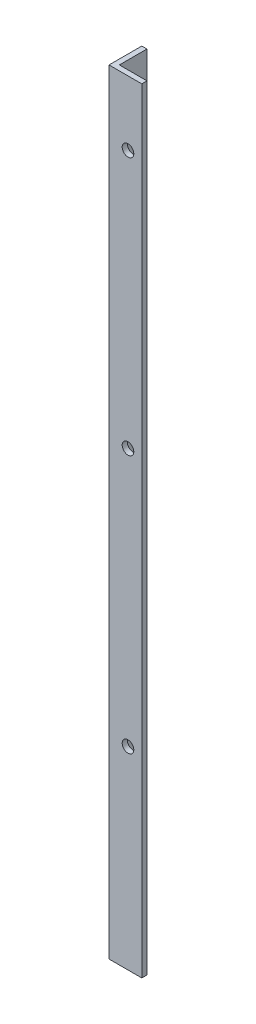
ISO-10303-21;
HEADER;
FILE_DESCRIPTION(('STEP AP214'),'2;1');
FILE_NAME('part.step','',(''),(''),'','','');
FILE_SCHEMA(('AUTOMOTIVE_DESIGN { 1 0 10303 214 1 1 1 1 }'));
ENDSEC;
DATA;
#1=APPLICATION_CONTEXT('core data for automotive mechanical design processes');
#2=APPLICATION_PROTOCOL_DEFINITION('international standard','automotive_design',2000,#1);
#3=PRODUCT_CONTEXT('',#1,'mechanical');
#4=PRODUCT('Part','Part','',(#3));
#5=PRODUCT_RELATED_PRODUCT_CATEGORY('part','',(#4));
#6=PRODUCT_DEFINITION_FORMATION('','',#4);
#7=PRODUCT_DEFINITION_CONTEXT('part definition',#1,'design');
#8=PRODUCT_DEFINITION('design','',#6,#7);
#9=PRODUCT_DEFINITION_SHAPE('','',#8);
#10=(LENGTH_UNIT() NAMED_UNIT(*) SI_UNIT(.MILLI.,.METRE.));
#11=(NAMED_UNIT(*) PLANE_ANGLE_UNIT() SI_UNIT($,.RADIAN.));
#12=(NAMED_UNIT(*) SI_UNIT($,.STERADIAN.) SOLID_ANGLE_UNIT());
#13=UNCERTAINTY_MEASURE_WITH_UNIT(LENGTH_MEASURE(1.E-05),#10,'distance_accuracy_value','');
#14=(GEOMETRIC_REPRESENTATION_CONTEXT(3) GLOBAL_UNCERTAINTY_ASSIGNED_CONTEXT((#13)) GLOBAL_UNIT_ASSIGNED_CONTEXT((#10,
#11,#12)) REPRESENTATION_CONTEXT('',''));
#15=CARTESIAN_POINT('',(0.,0.,0.));
#16=DIRECTION('',(0.,0.,1.));
#17=DIRECTION('',(1.,0.,0.));
#18=AXIS2_PLACEMENT_3D('',#15,#16,#17);
#19=CARTESIAN_POINT('',(0.,300.,0.));
#20=DIRECTION('',(1.,0.,0.));
#21=DIRECTION('',(0.,0.,-1.));
#22=AXIS2_PLACEMENT_3D('',#19,#20,#21);
#23=PLANE('',#22);
#24=CARTESIAN_POINT('',(0.,253.6,-7.94000000000002));
#25=DIRECTION('',(-1.,0.,0.));
#26=DIRECTION('',(0.,0.,1.));
#27=AXIS2_PLACEMENT_3D('',#24,#25,#26);
#28=CIRCLE('',#27,2.25000000000001);
#29=CARTESIAN_POINT('',(0.,253.6,-5.69000000000001));
#30=VERTEX_POINT('',#29);
#31=EDGE_CURVE('E167',#30,#30,#28,.T.);
#32=ORIENTED_EDGE('',*,*,#31,.F.);
#33=EDGE_LOOP('',(#32));
#34=FACE_BOUND('',#33,.T.);
#35=CARTESIAN_POINT('',(0.,225.,-7.35000000000001));
#36=DIRECTION('',(1.,0.,0.));
#37=DIRECTION('',(0.,0.,-1.));
#38=AXIS2_PLACEMENT_3D('',#35,#36,#37);
#39=CIRCLE('',#38,2.25);
#40=CARTESIAN_POINT('',(0.,225.,-9.60000000000001));
#41=VERTEX_POINT('',#40);
#42=EDGE_CURVE('E171',#41,#41,#39,.T.);
#43=ORIENTED_EDGE('',*,*,#42,.T.);
#44=EDGE_LOOP('',(#43));
#45=FACE_BOUND('',#44,.T.);
#46=CARTESIAN_POINT('',(0.,125.,-7.35000000000001));
#47=DIRECTION('',(1.,0.,0.));
#48=DIRECTION('',(0.,0.,-1.));
#49=AXIS2_PLACEMENT_3D('',#46,#47,#48);
#50=CIRCLE('',#49,2.25);
#51=CARTESIAN_POINT('',(0.,125.,-9.60000000000001));
#52=VERTEX_POINT('',#51);
#53=EDGE_CURVE('E175',#52,#52,#50,.T.);
#54=ORIENTED_EDGE('',*,*,#53,.T.);
#55=EDGE_LOOP('',(#54));
#56=FACE_BOUND('',#55,.T.);
#57=CARTESIAN_POINT('',(0.,25.,-7.35000000000001));
#58=DIRECTION('',(1.,0.,0.));
#59=DIRECTION('',(0.,0.,-1.));
#60=AXIS2_PLACEMENT_3D('',#57,#58,#59);
#61=CIRCLE('',#60,2.25);
#62=CARTESIAN_POINT('',(0.,25.,-9.60000000000001));
#63=VERTEX_POINT('',#62);
#64=EDGE_CURVE('E178',#63,#63,#61,.T.);
#65=ORIENTED_EDGE('',*,*,#64,.T.);
#66=EDGE_LOOP('',(#65));
#67=FACE_BOUND('',#66,.T.);
#68=DIRECTION('',(0.,0.,1.));
#69=VECTOR('',#68,1.);
#70=CARTESIAN_POINT('',(0.,0.,0.));
#71=LINE('',#70,#69);
#72=CARTESIAN_POINT('',(0.,0.,-12.7));
#73=VERTEX_POINT('',#72);
#74=CARTESIAN_POINT('',(0.,0.,0.));
#75=VERTEX_POINT('',#74);
#76=EDGE_CURVE('E121',#73,#75,#71,.T.);
#77=ORIENTED_EDGE('',*,*,#76,.T.);
#78=DIRECTION('',(0.,-1.,0.));
#79=VECTOR('',#78,1.);
#80=CARTESIAN_POINT('',(0.,300.,0.));
#81=LINE('',#80,#79);
#82=CARTESIAN_POINT('',(0.,300.,0.));
#83=VERTEX_POINT('',#82);
#84=EDGE_CURVE('E11',#83,#75,#81,.T.);
#85=ORIENTED_EDGE('',*,*,#84,.F.);
#86=DIRECTION('',(0.,0.,1.));
#87=VECTOR('',#86,1.);
#88=CARTESIAN_POINT('',(0.,300.,0.));
#89=LINE('',#88,#87);
#90=CARTESIAN_POINT('',(0.,300.,-12.7));
#91=VERTEX_POINT('',#90);
#92=EDGE_CURVE('E132',#91,#83,#89,.T.);
#93=ORIENTED_EDGE('',*,*,#92,.F.);
#94=DIRECTION('',(0.,-1.,0.));
#95=VECTOR('',#94,1.);
#96=CARTESIAN_POINT('',(0.,300.,-12.7));
#97=LINE('',#96,#95);
#98=EDGE_CURVE('E117',#91,#73,#97,.T.);
#99=ORIENTED_EDGE('',*,*,#98,.T.);
#100=EDGE_LOOP('',(#77,#85,#93,#99));
#101=FACE_BOUND('',#100,.T.);
#102=ADVANCED_FACE('F36',(#34,#45,#56,#67,#101),#23,.F.);
#103=CARTESIAN_POINT('',(0.,300.,0.));
#104=DIRECTION('',(0.,0.,-1.));
#105=DIRECTION('',(-1.,0.,0.));
#106=AXIS2_PLACEMENT_3D('',#103,#104,#105);
#107=PLANE('',#106);
#108=CARTESIAN_POINT('',(7.35,275.,0.));
#109=DIRECTION('',(0.,0.,-1.));
#110=DIRECTION('',(-1.,0.,0.));
#111=AXIS2_PLACEMENT_3D('',#108,#109,#110);
#112=CIRCLE('',#111,2.25);
#113=CARTESIAN_POINT('',(5.09999999999999,275.,0.));
#114=VERTEX_POINT('',#113);
#115=EDGE_CURVE('E125',#114,#114,#112,.T.);
#116=ORIENTED_EDGE('',*,*,#115,.T.);
#117=EDGE_LOOP('',(#116));
#118=FACE_BOUND('',#117,.T.);
#119=CARTESIAN_POINT('',(7.35,175.,0.));
#120=DIRECTION('',(0.,0.,-1.));
#121=DIRECTION('',(-1.,0.,0.));
#122=AXIS2_PLACEMENT_3D('',#119,#120,#121);
#123=CIRCLE('',#122,2.25);
#124=CARTESIAN_POINT('',(5.09999999999999,175.,0.));
#125=VERTEX_POINT('',#124);
#126=EDGE_CURVE('E203',#125,#125,#123,.T.);
#127=ORIENTED_EDGE('',*,*,#126,.T.);
#128=EDGE_LOOP('',(#127));
#129=FACE_BOUND('',#128,.T.);
#130=CARTESIAN_POINT('',(7.35,75.,0.));
#131=DIRECTION('',(0.,0.,-1.));
#132=DIRECTION('',(-1.,0.,0.));
#133=AXIS2_PLACEMENT_3D('',#130,#131,#132);
#134=CIRCLE('',#133,2.25);
#135=CARTESIAN_POINT('',(5.09999999999999,75.,0.));
#136=VERTEX_POINT('',#135);
#137=EDGE_CURVE('E195',#136,#136,#134,.T.);
#138=ORIENTED_EDGE('',*,*,#137,.T.);
#139=EDGE_LOOP('',(#138));
#140=FACE_BOUND('',#139,.T.);
#141=DIRECTION('',(1.,0.,0.));
#142=VECTOR('',#141,1.);
#143=CARTESIAN_POINT('',(0.,0.,0.));
#144=LINE('',#143,#142);
#145=CARTESIAN_POINT('',(12.7,0.,0.));
#146=VERTEX_POINT('',#145);
#147=EDGE_CURVE('E124',#75,#146,#144,.T.);
#148=ORIENTED_EDGE('',*,*,#147,.T.);
#149=DIRECTION('',(0.,-1.,0.));
#150=VECTOR('',#149,1.);
#151=CARTESIAN_POINT('',(12.7,300.,0.));
#152=LINE('',#151,#150);
#153=CARTESIAN_POINT('',(12.7,300.,0.));
#154=VERTEX_POINT('',#153);
#155=EDGE_CURVE('E45',#154,#146,#152,.T.);
#156=ORIENTED_EDGE('',*,*,#155,.F.);
#157=DIRECTION('',(1.,0.,0.));
#158=VECTOR('',#157,1.);
#159=CARTESIAN_POINT('',(0.,300.,0.));
#160=LINE('',#159,#158);
#161=EDGE_CURVE('E90',#83,#154,#160,.T.);
#162=ORIENTED_EDGE('',*,*,#161,.F.);
#163=ORIENTED_EDGE('',*,*,#84,.T.);
#164=EDGE_LOOP('',(#148,#156,#162,#163));
#165=FACE_BOUND('',#164,.T.);
#166=ADVANCED_FACE('F158',(#118,#129,#140,#165),#107,.F.);
#167=CARTESIAN_POINT('',(12.7,300.,0.));
#168=DIRECTION('',(-1.,0.,0.));
#169=DIRECTION('',(0.,0.,1.));
#170=AXIS2_PLACEMENT_3D('',#167,#168,#169);
#171=PLANE('',#170);
#172=DIRECTION('',(0.,0.,-1.));
#173=VECTOR('',#172,1.);
#174=CARTESIAN_POINT('',(12.7,0.,0.));
#175=LINE('',#174,#173);
#176=CARTESIAN_POINT('',(12.7,0.,-2.));
#177=VERTEX_POINT('',#176);
#178=EDGE_CURVE('E127',#146,#177,#175,.T.);
#179=ORIENTED_EDGE('',*,*,#178,.T.);
#180=DIRECTION('',(0.,-1.,0.));
#181=VECTOR('',#180,1.);
#182=CARTESIAN_POINT('',(12.7,300.,-2.));
#183=LINE('',#182,#181);
#184=CARTESIAN_POINT('',(12.7,300.,-2.));
#185=VERTEX_POINT('',#184);
#186=EDGE_CURVE('E112',#185,#177,#183,.T.);
#187=ORIENTED_EDGE('',*,*,#186,.F.);
#188=DIRECTION('',(0.,0.,-1.));
#189=VECTOR('',#188,1.);
#190=CARTESIAN_POINT('',(12.7,300.,0.));
#191=LINE('',#190,#189);
#192=EDGE_CURVE('E103',#154,#185,#191,.T.);
#193=ORIENTED_EDGE('',*,*,#192,.F.);
#194=ORIENTED_EDGE('',*,*,#155,.T.);
#195=EDGE_LOOP('',(#179,#187,#193,#194));
#196=FACE_BOUND('',#195,.T.);
#197=ADVANCED_FACE('F139',(#196),#171,.F.);
#198=CARTESIAN_POINT('',(2.,300.,-2.));
#199=DIRECTION('',(0.,0.,1.));
#200=DIRECTION('',(1.,0.,0.));
#201=AXIS2_PLACEMENT_3D('',#198,#199,#200);
#202=PLANE('',#201);
#203=CARTESIAN_POINT('',(7.35,275.,-2.));
#204=DIRECTION('',(0.,0.,-1.));
#205=DIRECTION('',(-1.,0.,0.));
#206=AXIS2_PLACEMENT_3D('',#203,#204,#205);
#207=CIRCLE('',#206,2.25);
#208=CARTESIAN_POINT('',(5.09999999999999,275.,-2.));
#209=VERTEX_POINT('',#208);
#210=EDGE_CURVE('E192',#209,#209,#207,.T.);
#211=ORIENTED_EDGE('',*,*,#210,.F.);
#212=EDGE_LOOP('',(#211));
#213=FACE_BOUND('',#212,.T.);
#214=CARTESIAN_POINT('',(7.35,175.,-2.));
#215=DIRECTION('',(0.,0.,-1.));
#216=DIRECTION('',(-1.,0.,0.));
#217=AXIS2_PLACEMENT_3D('',#214,#215,#216);
#218=CIRCLE('',#217,2.25);
#219=CARTESIAN_POINT('',(5.09999999999999,175.,-2.));
#220=VERTEX_POINT('',#219);
#221=EDGE_CURVE('E196',#220,#220,#218,.T.);
#222=ORIENTED_EDGE('',*,*,#221,.F.);
#223=EDGE_LOOP('',(#222));
#224=FACE_BOUND('',#223,.T.);
#225=CARTESIAN_POINT('',(7.35,75.,-2.));
#226=DIRECTION('',(0.,0.,-1.));
#227=DIRECTION('',(-1.,0.,0.));
#228=AXIS2_PLACEMENT_3D('',#225,#226,#227);
#229=CIRCLE('',#228,2.25);
#230=CARTESIAN_POINT('',(5.09999999999999,75.,-2.));
#231=VERTEX_POINT('',#230);
#232=EDGE_CURVE('E191',#231,#231,#229,.T.);
#233=ORIENTED_EDGE('',*,*,#232,.F.);
#234=EDGE_LOOP('',(#233));
#235=FACE_BOUND('',#234,.T.);
#236=DIRECTION('',(-1.,0.,0.));
#237=VECTOR('',#236,1.);
#238=CARTESIAN_POINT('',(2.,0.,-2.));
#239=LINE('',#238,#237);
#240=CARTESIAN_POINT('',(2.,0.,-2.));
#241=VERTEX_POINT('',#240);
#242=EDGE_CURVE('E111',#177,#241,#239,.T.);
#243=ORIENTED_EDGE('',*,*,#242,.T.);
#244=DIRECTION('',(0.,-1.,0.));
#245=VECTOR('',#244,1.);
#246=CARTESIAN_POINT('',(2.,300.,-2.));
#247=LINE('',#246,#245);
#248=CARTESIAN_POINT('',(2.,300.,-2.));
#249=VERTEX_POINT('',#248);
#250=EDGE_CURVE('E108',#249,#241,#247,.T.);
#251=ORIENTED_EDGE('',*,*,#250,.F.);
#252=DIRECTION('',(-1.,0.,0.));
#253=VECTOR('',#252,1.);
#254=CARTESIAN_POINT('',(2.,300.,-2.));
#255=LINE('',#254,#253);
#256=EDGE_CURVE('E97',#185,#249,#255,.T.);
#257=ORIENTED_EDGE('',*,*,#256,.F.);
#258=ORIENTED_EDGE('',*,*,#186,.T.);
#259=EDGE_LOOP('',(#243,#251,#257,#258));
#260=FACE_BOUND('',#259,.T.);
#261=ADVANCED_FACE('F109',(#213,#224,#235,#260),#202,.F.);
#262=CARTESIAN_POINT('',(2.,300.,-2.));
#263=DIRECTION('',(-1.,0.,0.));
#264=DIRECTION('',(0.,0.,1.));
#265=AXIS2_PLACEMENT_3D('',#262,#263,#264);
#266=PLANE('',#265);
#267=CARTESIAN_POINT('',(2.,253.6,-7.94000000000002));
#268=DIRECTION('',(-1.,0.,0.));
#269=DIRECTION('',(0.,0.,1.));
#270=AXIS2_PLACEMENT_3D('',#267,#268,#269);
#271=CIRCLE('',#270,2.25000000000001);
#272=CARTESIAN_POINT('',(2.,253.6,-5.69000000000001));
#273=VERTEX_POINT('',#272);
#274=EDGE_CURVE('E39',#273,#273,#271,.T.);
#275=ORIENTED_EDGE('',*,*,#274,.T.);
#276=EDGE_LOOP('',(#275));
#277=FACE_BOUND('',#276,.T.);
#278=CARTESIAN_POINT('',(2.,225.,-7.35000000000001));
#279=DIRECTION('',(1.,0.,0.));
#280=DIRECTION('',(0.,0.,-1.));
#281=AXIS2_PLACEMENT_3D('',#278,#279,#280);
#282=CIRCLE('',#281,2.25);
#283=CARTESIAN_POINT('',(2.,225.,-9.60000000000001));
#284=VERTEX_POINT('',#283);
#285=EDGE_CURVE('E180',#284,#284,#282,.T.);
#286=ORIENTED_EDGE('',*,*,#285,.F.);
#287=EDGE_LOOP('',(#286));
#288=FACE_BOUND('',#287,.T.);
#289=CARTESIAN_POINT('',(2.,125.,-7.35000000000001));
#290=DIRECTION('',(1.,0.,0.));
#291=DIRECTION('',(0.,0.,-1.));
#292=AXIS2_PLACEMENT_3D('',#289,#290,#291);
#293=CIRCLE('',#292,2.25);
#294=CARTESIAN_POINT('',(2.,125.,-9.60000000000001));
#295=VERTEX_POINT('',#294);
#296=EDGE_CURVE('E184',#295,#295,#293,.T.);
#297=ORIENTED_EDGE('',*,*,#296,.F.);
#298=EDGE_LOOP('',(#297));
#299=FACE_BOUND('',#298,.T.);
#300=CARTESIAN_POINT('',(2.,25.,-7.35000000000001));
#301=DIRECTION('',(1.,0.,0.));
#302=DIRECTION('',(0.,0.,-1.));
#303=AXIS2_PLACEMENT_3D('',#300,#301,#302);
#304=CIRCLE('',#303,2.25);
#305=CARTESIAN_POINT('',(2.,25.,-9.60000000000001));
#306=VERTEX_POINT('',#305);
#307=EDGE_CURVE('E187',#306,#306,#304,.T.);
#308=ORIENTED_EDGE('',*,*,#307,.F.);
#309=EDGE_LOOP('',(#308));
#310=FACE_BOUND('',#309,.T.);
#311=DIRECTION('',(0.,0.,-1.));
#312=VECTOR('',#311,1.);
#313=CARTESIAN_POINT('',(2.,0.,-2.));
#314=LINE('',#313,#312);
#315=CARTESIAN_POINT('',(2.,0.,-12.7));
#316=VERTEX_POINT('',#315);
#317=EDGE_CURVE('E76',#241,#316,#314,.T.);
#318=ORIENTED_EDGE('',*,*,#317,.T.);
#319=DIRECTION('',(0.,-1.,0.));
#320=VECTOR('',#319,1.);
#321=CARTESIAN_POINT('',(2.,300.,-12.7));
#322=LINE('',#321,#320);
#323=CARTESIAN_POINT('',(2.,300.,-12.7));
#324=VERTEX_POINT('',#323);
#325=EDGE_CURVE('E113',#324,#316,#322,.T.);
#326=ORIENTED_EDGE('',*,*,#325,.F.);
#327=DIRECTION('',(0.,0.,-1.));
#328=VECTOR('',#327,1.);
#329=CARTESIAN_POINT('',(2.,300.,-2.));
#330=LINE('',#329,#328);
#331=EDGE_CURVE('E101',#249,#324,#330,.T.);
#332=ORIENTED_EDGE('',*,*,#331,.F.);
#333=ORIENTED_EDGE('',*,*,#250,.T.);
#334=EDGE_LOOP('',(#318,#326,#332,#333));
#335=FACE_BOUND('',#334,.T.);
#336=ADVANCED_FACE('F115',(#277,#288,#299,#310,#335),#266,.F.);
#337=CARTESIAN_POINT('',(0.,300.,-12.7));
#338=DIRECTION('',(0.,0.,1.));
#339=DIRECTION('',(1.,0.,0.));
#340=AXIS2_PLACEMENT_3D('',#337,#338,#339);
#341=PLANE('',#340);
#342=DIRECTION('',(-1.,0.,0.));
#343=VECTOR('',#342,1.);
#344=CARTESIAN_POINT('',(0.,0.,-12.7));
#345=LINE('',#344,#343);
#346=EDGE_CURVE('E82',#316,#73,#345,.T.);
#347=ORIENTED_EDGE('',*,*,#346,.T.);
#348=ORIENTED_EDGE('',*,*,#98,.F.);
#349=DIRECTION('',(-1.,0.,0.));
#350=VECTOR('',#349,1.);
#351=CARTESIAN_POINT('',(0.,300.,-12.7));
#352=LINE('',#351,#350);
#353=EDGE_CURVE('E53',#324,#91,#352,.T.);
#354=ORIENTED_EDGE('',*,*,#353,.F.);
#355=ORIENTED_EDGE('',*,*,#325,.T.);
#356=EDGE_LOOP('',(#347,#348,#354,#355));
#357=FACE_BOUND('',#356,.T.);
#358=ADVANCED_FACE('F146',(#357),#341,.F.);
#359=CARTESIAN_POINT('',(0.,300.,0.));
#360=DIRECTION('',(0.,-1.,0.));
#361=DIRECTION('',(0.,0.,-1.));
#362=AXIS2_PLACEMENT_3D('',#359,#360,#361);
#363=PLANE('',#362);
#364=ORIENTED_EDGE('',*,*,#92,.T.);
#365=ORIENTED_EDGE('',*,*,#161,.T.);
#366=ORIENTED_EDGE('',*,*,#192,.T.);
#367=ORIENTED_EDGE('',*,*,#256,.T.);
#368=ORIENTED_EDGE('',*,*,#331,.T.);
#369=ORIENTED_EDGE('',*,*,#353,.T.);
#370=EDGE_LOOP('',(#364,#365,#366,#367,#368,#369));
#371=FACE_BOUND('',#370,.T.);
#372=ADVANCED_FACE('F99',(#371),#363,.F.);
#373=CARTESIAN_POINT('',(0.,0.,0.));
#374=DIRECTION('',(0.,-1.,0.));
#375=DIRECTION('',(0.,0.,-1.));
#376=AXIS2_PLACEMENT_3D('',#373,#374,#375);
#377=PLANE('',#376);
#378=ORIENTED_EDGE('',*,*,#76,.F.);
#379=ORIENTED_EDGE('',*,*,#346,.F.);
#380=ORIENTED_EDGE('',*,*,#317,.F.);
#381=ORIENTED_EDGE('',*,*,#242,.F.);
#382=ORIENTED_EDGE('',*,*,#178,.F.);
#383=ORIENTED_EDGE('',*,*,#147,.F.);
#384=EDGE_LOOP('',(#378,#379,#380,#381,#382,#383));
#385=FACE_BOUND('',#384,.T.);
#386=ADVANCED_FACE('F142',(#385),#377,.T.);
#387=CARTESIAN_POINT('',(7.35,75.,8.));
#388=DIRECTION('',(0.,0.,-1.));
#389=DIRECTION('',(-1.,0.,0.));
#390=AXIS2_PLACEMENT_3D('',#387,#388,#389);
#391=CYLINDRICAL_SURFACE('',#390,2.25);
#392=ORIENTED_EDGE('',*,*,#232,.T.);
#393=EDGE_LOOP('',(#392));
#394=FACE_BOUND('',#393,.T.);
#395=ORIENTED_EDGE('',*,*,#137,.F.);
#396=EDGE_LOOP('',(#395));
#397=FACE_BOUND('',#396,.T.);
#398=ADVANCED_FACE('F225',(#394,#397),#391,.F.);
#399=CARTESIAN_POINT('',(7.35,175.,8.));
#400=DIRECTION('',(0.,0.,-1.));
#401=DIRECTION('',(-1.,0.,0.));
#402=AXIS2_PLACEMENT_3D('',#399,#400,#401);
#403=CYLINDRICAL_SURFACE('',#402,2.25);
#404=ORIENTED_EDGE('',*,*,#221,.T.);
#405=EDGE_LOOP('',(#404));
#406=FACE_BOUND('',#405,.T.);
#407=ORIENTED_EDGE('',*,*,#126,.F.);
#408=EDGE_LOOP('',(#407));
#409=FACE_BOUND('',#408,.T.);
#410=ADVANCED_FACE('F215',(#406,#409),#403,.F.);
#411=CARTESIAN_POINT('',(7.35,275.,8.));
#412=DIRECTION('',(0.,0.,-1.));
#413=DIRECTION('',(-1.,0.,0.));
#414=AXIS2_PLACEMENT_3D('',#411,#412,#413);
#415=CYLINDRICAL_SURFACE('',#414,2.25);
#416=ORIENTED_EDGE('',*,*,#210,.T.);
#417=EDGE_LOOP('',(#416));
#418=FACE_BOUND('',#417,.T.);
#419=ORIENTED_EDGE('',*,*,#115,.F.);
#420=EDGE_LOOP('',(#419));
#421=FACE_BOUND('',#420,.T.);
#422=ADVANCED_FACE('F212',(#418,#421),#415,.F.);
#423=CARTESIAN_POINT('',(-8.,25.,-7.35000000000001));
#424=DIRECTION('',(1.,0.,0.));
#425=DIRECTION('',(0.,0.,-1.));
#426=AXIS2_PLACEMENT_3D('',#423,#424,#425);
#427=CYLINDRICAL_SURFACE('',#426,2.25);
#428=ORIENTED_EDGE('',*,*,#307,.T.);
#429=EDGE_LOOP('',(#428));
#430=FACE_BOUND('',#429,.T.);
#431=ORIENTED_EDGE('',*,*,#64,.F.);
#432=EDGE_LOOP('',(#431));
#433=FACE_BOUND('',#432,.T.);
#434=ADVANCED_FACE('F214',(#430,#433),#427,.F.);
#435=CARTESIAN_POINT('',(-8.,125.,-7.35000000000001));
#436=DIRECTION('',(1.,0.,0.));
#437=DIRECTION('',(0.,0.,-1.));
#438=AXIS2_PLACEMENT_3D('',#435,#436,#437);
#439=CYLINDRICAL_SURFACE('',#438,2.25);
#440=ORIENTED_EDGE('',*,*,#296,.T.);
#441=EDGE_LOOP('',(#440));
#442=FACE_BOUND('',#441,.T.);
#443=ORIENTED_EDGE('',*,*,#53,.F.);
#444=EDGE_LOOP('',(#443));
#445=FACE_BOUND('',#444,.T.);
#446=ADVANCED_FACE('F222',(#442,#445),#439,.F.);
#447=CARTESIAN_POINT('',(-8.,225.,-7.35000000000001));
#448=DIRECTION('',(1.,0.,0.));
#449=DIRECTION('',(0.,0.,-1.));
#450=AXIS2_PLACEMENT_3D('',#447,#448,#449);
#451=CYLINDRICAL_SURFACE('',#450,2.25);
#452=ORIENTED_EDGE('',*,*,#285,.T.);
#453=EDGE_LOOP('',(#452));
#454=FACE_BOUND('',#453,.T.);
#455=ORIENTED_EDGE('',*,*,#42,.F.);
#456=EDGE_LOOP('',(#455));
#457=FACE_BOUND('',#456,.T.);
#458=ADVANCED_FACE('F269',(#454,#457),#451,.F.);
#459=CARTESIAN_POINT('',(10.,253.6,-7.94000000000002));
#460=DIRECTION('',(-1.,0.,0.));
#461=DIRECTION('',(0.,0.,1.));
#462=AXIS2_PLACEMENT_3D('',#459,#460,#461);
#463=CYLINDRICAL_SURFACE('',#462,2.25000000000001);
#464=ORIENTED_EDGE('',*,*,#31,.T.);
#465=EDGE_LOOP('',(#464));
#466=FACE_BOUND('',#465,.T.);
#467=ORIENTED_EDGE('',*,*,#274,.F.);
#468=EDGE_LOOP('',(#467));
#469=FACE_BOUND('',#468,.T.);
#470=ADVANCED_FACE('F278',(#466,#469),#463,.F.);
#471=CLOSED_SHELL('',(#102,#166,#197,#261,#336,#358,#372,#386,#398,#410,#422,#434,#446,#458,#470));
#472=MANIFOLD_SOLID_BREP('B2',#471);
#473=ADVANCED_BREP_SHAPE_REPRESENTATION('',(#18,#472),#14);
#474=SHAPE_DEFINITION_REPRESENTATION(#9,#473);
ENDSEC;
END-ISO-10303-21;
